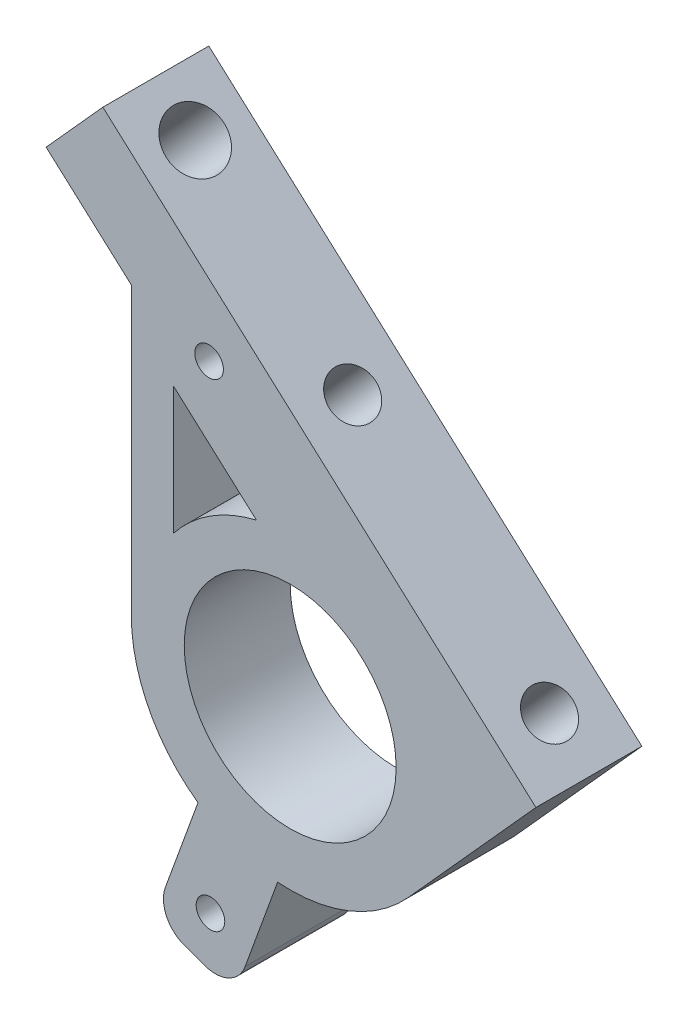
ISO-10303-21;
HEADER;
FILE_DESCRIPTION(('STEP AP214'),'2;1');
FILE_NAME('part.step','',(''),(''),'','','');
FILE_SCHEMA(('AUTOMOTIVE_DESIGN { 1 0 10303 214 1 1 1 1 }'));
ENDSEC;
DATA;
#1=APPLICATION_CONTEXT('core data for automotive mechanical design processes');
#2=APPLICATION_PROTOCOL_DEFINITION('international standard','automotive_design',2000,#1);
#3=PRODUCT_CONTEXT('',#1,'mechanical');
#4=PRODUCT('Part','Part','',(#3));
#5=PRODUCT_RELATED_PRODUCT_CATEGORY('part','',(#4));
#6=PRODUCT_DEFINITION_FORMATION('','',#4);
#7=PRODUCT_DEFINITION_CONTEXT('part definition',#1,'design');
#8=PRODUCT_DEFINITION('design','',#6,#7);
#9=PRODUCT_DEFINITION_SHAPE('','',#8);
#10=(LENGTH_UNIT() NAMED_UNIT(*) SI_UNIT(.MILLI.,.METRE.));
#11=(NAMED_UNIT(*) PLANE_ANGLE_UNIT() SI_UNIT($,.RADIAN.));
#12=(NAMED_UNIT(*) SI_UNIT($,.STERADIAN.) SOLID_ANGLE_UNIT());
#13=UNCERTAINTY_MEASURE_WITH_UNIT(LENGTH_MEASURE(1.E-05),#10,'distance_accuracy_value','');
#14=(GEOMETRIC_REPRESENTATION_CONTEXT(3) GLOBAL_UNCERTAINTY_ASSIGNED_CONTEXT((#13)) GLOBAL_UNIT_ASSIGNED_CONTEXT((#10,
#11,#12)) REPRESENTATION_CONTEXT('',''));
#15=CARTESIAN_POINT('',(0.,0.,0.));
#16=DIRECTION('',(0.,0.,1.));
#17=DIRECTION('',(1.,0.,0.));
#18=AXIS2_PLACEMENT_3D('',#15,#16,#17);
#19=CARTESIAN_POINT('',(0.,0.,10.));
#20=DIRECTION('',(0.,0.,-1.));
#21=DIRECTION('',(-1.,0.,0.));
#22=AXIS2_PLACEMENT_3D('',#19,#20,#21);
#23=CYLINDRICAL_SURFACE('',#22,15.);
#24=DIRECTION('',(0.,0.,-1.));
#25=VECTOR('',#24,1.);
#26=CARTESIAN_POINT('',(-8.70329833664658,-12.2168980540612,28.2048131289452));
#27=LINE('',#26,#25);
#28=CARTESIAN_POINT('',(-8.70329833664658,-12.2168980540612,10.));
#29=VERTEX_POINT('',#28);
#30=CARTESIAN_POINT('',(-8.70329833664658,-12.2168980540612,0.));
#31=VERTEX_POINT('',#30);
#32=EDGE_CURVE('E199',#29,#31,#27,.T.);
#33=ORIENTED_EDGE('',*,*,#32,.F.);
#34=CARTESIAN_POINT('',(0.,0.,10.));
#35=DIRECTION('',(0.,0.,1.));
#36=DIRECTION('',(1.,0.,0.));
#37=AXIS2_PLACEMENT_3D('',#34,#35,#36);
#38=CIRCLE('',#37,15.);
#39=CARTESIAN_POINT('',(-15.,0.,10.));
#40=VERTEX_POINT('',#39);
#41=EDGE_CURVE('E227',#40,#29,#38,.T.);
#42=ORIENTED_EDGE('',*,*,#41,.F.);
#43=DIRECTION('',(0.,0.,-1.));
#44=VECTOR('',#43,1.);
#45=CARTESIAN_POINT('',(-15.,0.,10.));
#46=LINE('',#45,#44);
#47=CARTESIAN_POINT('',(-15.,0.,0.));
#48=VERTEX_POINT('',#47);
#49=EDGE_CURVE('E241',#40,#48,#46,.T.);
#50=ORIENTED_EDGE('',*,*,#49,.T.);
#51=CARTESIAN_POINT('',(0.,0.,0.));
#52=DIRECTION('',(0.,0.,1.));
#53=DIRECTION('',(1.,0.,0.));
#54=AXIS2_PLACEMENT_3D('',#51,#52,#53);
#55=CIRCLE('',#54,15.);
#56=EDGE_CURVE('E242',#48,#31,#55,.T.);
#57=ORIENTED_EDGE('',*,*,#56,.T.);
#58=EDGE_LOOP('',(#33,#42,#50,#57));
#59=FACE_BOUND('',#58,.T.);
#60=ADVANCED_FACE('F39',(#59),#23,.T.);
#61=DIRECTION('',(0.,0.,-1.));
#62=VECTOR('',#61,1.);
#63=CARTESIAN_POINT('',(-1.1857573703593,-14.9530592006665,28.2048131289452));
#64=LINE('',#63,#62);
#65=CARTESIAN_POINT('',(-1.1857573703593,-14.9530592006665,10.));
#66=VERTEX_POINT('',#65);
#67=CARTESIAN_POINT('',(-1.1857573703593,-14.9530592006665,0.));
#68=VERTEX_POINT('',#67);
#69=EDGE_CURVE('E202',#66,#68,#64,.T.);
#70=ORIENTED_EDGE('',*,*,#69,.T.);
#71=CARTESIAN_POINT('',(11.1471723821609,-10.0369590953829,0.));
#72=VERTEX_POINT('',#71);
#73=EDGE_CURVE('E224',#68,#72,#55,.T.);
#74=ORIENTED_EDGE('',*,*,#73,.T.);
#75=DIRECTION('',(0.,0.,-1.));
#76=VECTOR('',#75,1.);
#77=CARTESIAN_POINT('',(11.1471723821609,-10.0369590953829,10.));
#78=LINE('',#77,#76);
#79=CARTESIAN_POINT('',(11.1471723821609,-10.0369590953829,10.));
#80=VERTEX_POINT('',#79);
#81=EDGE_CURVE('E269',#80,#72,#78,.T.);
#82=ORIENTED_EDGE('',*,*,#81,.F.);
#83=EDGE_CURVE('E231',#66,#80,#38,.T.);
#84=ORIENTED_EDGE('',*,*,#83,.F.);
#85=EDGE_LOOP('',(#70,#74,#82,#84));
#86=FACE_BOUND('',#85,.T.);
#87=ADVANCED_FACE('F344',(#86),#23,.T.);
#88=CARTESIAN_POINT('',(0.,0.,10.));
#89=DIRECTION('',(0.,0.,1.));
#90=DIRECTION('',(1.,0.,0.));
#91=AXIS2_PLACEMENT_3D('',#88,#89,#90);
#92=PLANE('',#91);
#93=CARTESIAN_POINT('',(-7.6543469682057,24.3852304515143,10.));
#94=DIRECTION('',(0.,0.,1.));
#95=DIRECTION('',(1.,0.,0.));
#96=AXIS2_PLACEMENT_3D('',#93,#94,#95);
#97=CIRCLE('',#96,1.35);
#98=CARTESIAN_POINT('',(-6.3043469682057,24.3852304515143,10.));
#99=VERTEX_POINT('',#98);
#100=EDGE_CURVE('E442',#99,#99,#97,.T.);
#101=ORIENTED_EDGE('',*,*,#100,.F.);
#102=EDGE_LOOP('',(#101));
#103=FACE_BOUND('',#102,.T.);
#104=DIRECTION('',(-0.743144825477393,0.66913060635886,0.));
#105=VECTOR('',#104,1.);
#106=CARTESIAN_POINT('',(-11.,20.6695063241273,10.));
#107=LINE('',#106,#105);
#108=CARTESIAN_POINT('',(-3.18503915994004,13.632883977708,10.));
#109=VERTEX_POINT('',#108);
#110=CARTESIAN_POINT('',(-11.,20.6695063241273,10.));
#111=VERTEX_POINT('',#110);
#112=EDGE_CURVE('E54',#109,#111,#107,.T.);
#113=ORIENTED_EDGE('',*,*,#112,.F.);
#114=CARTESIAN_POINT('',(0.,0.,10.));
#115=DIRECTION('',(0.,0.,-1.));
#116=DIRECTION('',(-1.,0.,0.));
#117=AXIS2_PLACEMENT_3D('',#114,#115,#116);
#118=CIRCLE('',#117,14.);
#119=CARTESIAN_POINT('',(-11.,8.66025403784439,10.));
#120=VERTEX_POINT('',#119);
#121=EDGE_CURVE('E160',#120,#109,#118,.T.);
#122=ORIENTED_EDGE('',*,*,#121,.F.);
#123=DIRECTION('',(0.,-1.,0.));
#124=VECTOR('',#123,1.);
#125=CARTESIAN_POINT('',(-11.,20.6695063241273,10.));
#126=LINE('',#125,#124);
#127=EDGE_CURVE('E163',#111,#120,#126,.T.);
#128=ORIENTED_EDGE('',*,*,#127,.F.);
#129=EDGE_LOOP('',(#113,#122,#128));
#130=FACE_BOUND('',#129,.T.);
#131=CARTESIAN_POINT('',(-7.52444315316466,-20.67323765729,10.));
#132=DIRECTION('',(0.,0.,1.));
#133=DIRECTION('',(1.,0.,0.));
#134=AXIS2_PLACEMENT_3D('',#131,#132,#133);
#135=CIRCLE('',#134,1.35);
#136=CARTESIAN_POINT('',(-6.17444315316466,-20.67323765729,10.));
#137=VERTEX_POINT('',#136);
#138=EDGE_CURVE('E193',#137,#137,#135,.T.);
#139=ORIENTED_EDGE('',*,*,#138,.F.);
#140=EDGE_LOOP('',(#139));
#141=FACE_BOUND('',#140,.T.);
#142=DIRECTION('',(0.939692620785909,-0.342020143325666,0.));
#143=VECTOR('',#142,1.);
#144=CARTESIAN_POINT('',(-12.8075400565546,-23.4932095034921,10.));
#145=LINE('',#144,#143);
#146=CARTESIAN_POINT('',(-9.98846219419685,-24.5192699334691,10.));
#147=VERTEX_POINT('',#146);
#148=CARTESIAN_POINT('',(-8.10907695262503,-25.2033102201205,10.));
#149=VERTEX_POINT('',#148);
#150=EDGE_CURVE('E212',#147,#149,#145,.T.);
#151=ORIENTED_EDGE('',*,*,#150,.T.);
#152=CARTESIAN_POINT('',(-7.08301652264803,-22.3842323577627,10.));
#153=DIRECTION('',(0.,0.,1.));
#154=DIRECTION('',(1.,0.,0.));
#155=AXIS2_PLACEMENT_3D('',#152,#153,#154);
#156=CIRCLE('',#155,3.);
#157=CARTESIAN_POINT('',(-4.2639386602903,-23.4102927877397,10.));
#158=VERTEX_POINT('',#157);
#159=EDGE_CURVE('E47',#149,#158,#156,.T.);
#160=ORIENTED_EDGE('',*,*,#159,.T.);
#161=DIRECTION('',(0.342020143325667,0.939692620785909,0.));
#162=VECTOR('',#161,1.);
#163=CARTESIAN_POINT('',(-1.1857573703593,-14.9530592006665,10.));
#164=LINE('',#163,#162);
#165=EDGE_CURVE('E209',#158,#66,#164,.T.);
#166=ORIENTED_EDGE('',*,*,#165,.T.);
#167=ORIENTED_EDGE('',*,*,#83,.T.);
#168=DIRECTION('',(0.66913060635886,0.743144825477393,0.));
#169=VECTOR('',#168,1.);
#170=CARTESIAN_POINT('',(17.8384784457495,-2.60551084060896,10.));
#171=LINE('',#170,#169);
#172=CARTESIAN_POINT('',(23.1915232966204,3.33964776321019,10.));
#173=VERTEX_POINT('',#172);
#174=EDGE_CURVE('E230',#80,#173,#171,.T.);
#175=ORIENTED_EDGE('',*,*,#174,.T.);
#176=DIRECTION('',(-0.743144825477393,0.669130606358859,0.));
#177=VECTOR('',#176,1.);
#178=CARTESIAN_POINT('',(-17.6814421046363,40.1418311129475,10.));
#179=LINE('',#178,#177);
#180=CARTESIAN_POINT('',(-17.6814421046363,40.1418311129475,10.));
#181=VERTEX_POINT('',#180);
#182=EDGE_CURVE('E233',#173,#181,#179,.T.);
#183=ORIENTED_EDGE('',*,*,#182,.T.);
#184=DIRECTION('',(-0.669130606358859,-0.743144825477393,0.));
#185=VECTOR('',#184,1.);
#186=CARTESIAN_POINT('',(-23.0344869555071,34.1966725091283,10.));
#187=LINE('',#186,#185);
#188=CARTESIAN_POINT('',(-23.0344869555071,34.1966725091283,10.));
#189=VERTEX_POINT('',#188);
#190=EDGE_CURVE('E235',#181,#189,#187,.T.);
#191=ORIENTED_EDGE('',*,*,#190,.T.);
#192=DIRECTION('',(0.743144825477394,-0.669130606358859,0.));
#193=VECTOR('',#192,1.);
#194=CARTESIAN_POINT('',(-15.,26.9623879605314,10.));
#195=LINE('',#194,#193);
#196=CARTESIAN_POINT('',(-15.,26.9623879605314,10.));
#197=VERTEX_POINT('',#196);
#198=EDGE_CURVE('E237',#189,#197,#195,.T.);
#199=ORIENTED_EDGE('',*,*,#198,.T.);
#200=DIRECTION('',(0.,-1.,0.));
#201=VECTOR('',#200,1.);
#202=CARTESIAN_POINT('',(-15.,0.,10.));
#203=LINE('',#202,#201);
#204=EDGE_CURVE('E239',#197,#40,#203,.T.);
#205=ORIENTED_EDGE('',*,*,#204,.T.);
#206=ORIENTED_EDGE('',*,*,#41,.T.);
#207=DIRECTION('',(-0.342020143325666,-0.939692620785909,0.));
#208=VECTOR('',#207,1.);
#209=CARTESIAN_POINT('',(-8.70329833664658,-12.2168980540612,10.));
#210=LINE('',#209,#208);
#211=CARTESIAN_POINT('',(-11.7814796265776,-20.6741316411344,10.));
#212=VERTEX_POINT('',#211);
#213=EDGE_CURVE('E215',#29,#212,#210,.T.);
#214=ORIENTED_EDGE('',*,*,#213,.T.);
#215=CARTESIAN_POINT('',(-8.96240176421985,-21.7001920711114,10.));
#216=DIRECTION('',(0.,0.,1.));
#217=DIRECTION('',(1.,0.,0.));
#218=AXIS2_PLACEMENT_3D('',#215,#216,#217);
#219=CIRCLE('',#218,3.);
#220=EDGE_CURVE('E284',#212,#147,#219,.T.);
#221=ORIENTED_EDGE('',*,*,#220,.T.);
#222=EDGE_LOOP('',(#151,#160,#166,#167,#175,#183,#191,#199,#205,#206,#214,#221));
#223=FACE_BOUND('',#222,.T.);
#224=CARTESIAN_POINT('',(0.,0.,10.));
#225=DIRECTION('',(0.,0.,1.));
#226=DIRECTION('',(1.,0.,0.));
#227=AXIS2_PLACEMENT_3D('',#224,#225,#226);
#228=CIRCLE('',#227,10.);
#229=CARTESIAN_POINT('',(10.,0.,10.));
#230=VERTEX_POINT('',#229);
#231=EDGE_CURVE('E221',#230,#230,#228,.T.);
#232=ORIENTED_EDGE('',*,*,#231,.F.);
#233=EDGE_LOOP('',(#232));
#234=FACE_BOUND('',#233,.T.);
#235=ADVANCED_FACE('F288',(#103,#130,#141,#223,#234),#92,.T.);
#236=CARTESIAN_POINT('',(0.,0.,0.));
#237=DIRECTION('',(0.,0.,1.));
#238=DIRECTION('',(1.,0.,0.));
#239=AXIS2_PLACEMENT_3D('',#236,#237,#238);
#240=PLANE('',#239);
#241=CARTESIAN_POINT('',(-7.6543469682057,24.3852304515143,0.));
#242=DIRECTION('',(0.,0.,1.));
#243=DIRECTION('',(1.,0.,0.));
#244=AXIS2_PLACEMENT_3D('',#241,#242,#243);
#245=CIRCLE('',#244,1.35);
#246=CARTESIAN_POINT('',(-6.3043469682057,24.3852304515143,0.));
#247=VERTEX_POINT('',#246);
#248=EDGE_CURVE('E166',#247,#247,#245,.F.);
#249=ORIENTED_EDGE('',*,*,#248,.F.);
#250=EDGE_LOOP('',(#249));
#251=FACE_BOUND('',#250,.T.);
#252=CARTESIAN_POINT('',(0.,0.,0.));
#253=DIRECTION('',(0.,0.,-1.));
#254=DIRECTION('',(-1.,0.,0.));
#255=AXIS2_PLACEMENT_3D('',#252,#253,#254);
#256=CIRCLE('',#255,14.);
#257=CARTESIAN_POINT('',(-11.,8.66025403784439,0.));
#258=VERTEX_POINT('',#257);
#259=CARTESIAN_POINT('',(-3.18503915994004,13.632883977708,0.));
#260=VERTEX_POINT('',#259);
#261=EDGE_CURVE('E62',#258,#260,#256,.T.);
#262=ORIENTED_EDGE('',*,*,#261,.T.);
#263=DIRECTION('',(-0.743144825477393,0.66913060635886,0.));
#264=VECTOR('',#263,1.);
#265=CARTESIAN_POINT('',(-11.,20.6695063241273,0.));
#266=LINE('',#265,#264);
#267=CARTESIAN_POINT('',(-11.,20.6695063241273,0.));
#268=VERTEX_POINT('',#267);
#269=EDGE_CURVE('E147',#260,#268,#266,.T.);
#270=ORIENTED_EDGE('',*,*,#269,.T.);
#271=DIRECTION('',(0.,-1.,0.));
#272=VECTOR('',#271,1.);
#273=CARTESIAN_POINT('',(-11.,20.6695063241273,0.));
#274=LINE('',#273,#272);
#275=EDGE_CURVE('E154',#268,#258,#274,.T.);
#276=ORIENTED_EDGE('',*,*,#275,.T.);
#277=EDGE_LOOP('',(#262,#270,#276));
#278=FACE_BOUND('',#277,.T.);
#279=CARTESIAN_POINT('',(-7.52444315316466,-20.67323765729,0.));
#280=DIRECTION('',(0.,0.,1.));
#281=DIRECTION('',(1.,0.,0.));
#282=AXIS2_PLACEMENT_3D('',#279,#280,#281);
#283=CIRCLE('',#282,1.35);
#284=CARTESIAN_POINT('',(-6.17444315316466,-20.67323765729,0.));
#285=VERTEX_POINT('',#284);
#286=EDGE_CURVE('E196',#285,#285,#283,.F.);
#287=ORIENTED_EDGE('',*,*,#286,.F.);
#288=EDGE_LOOP('',(#287));
#289=FACE_BOUND('',#288,.T.);
#290=DIRECTION('',(0.342020143325666,0.939692620785909,0.));
#291=VECTOR('',#290,1.);
#292=CARTESIAN_POINT('',(-1.1857573703593,-14.9530592006665,0.));
#293=LINE('',#292,#291);
#294=CARTESIAN_POINT('',(-4.2639386602903,-23.4102927877397,0.));
#295=VERTEX_POINT('',#294);
#296=EDGE_CURVE('E200',#295,#68,#293,.T.);
#297=ORIENTED_EDGE('',*,*,#296,.F.);
#298=CARTESIAN_POINT('',(-7.08301652264803,-22.3842323577627,0.));
#299=DIRECTION('',(0.,0.,1.));
#300=DIRECTION('',(1.,0.,0.));
#301=AXIS2_PLACEMENT_3D('',#298,#299,#300);
#302=CIRCLE('',#301,3.);
#303=CARTESIAN_POINT('',(-8.10907695262503,-25.2033102201205,0.));
#304=VERTEX_POINT('',#303);
#305=EDGE_CURVE('E277',#295,#304,#302,.F.);
#306=ORIENTED_EDGE('',*,*,#305,.T.);
#307=DIRECTION('',(0.939692620785909,-0.342020143325666,0.));
#308=VECTOR('',#307,1.);
#309=CARTESIAN_POINT('',(-12.8075400565546,-23.4932095034921,0.));
#310=LINE('',#309,#308);
#311=CARTESIAN_POINT('',(-9.98846219419685,-24.5192699334691,0.));
#312=VERTEX_POINT('',#311);
#313=EDGE_CURVE('E203',#312,#304,#310,.T.);
#314=ORIENTED_EDGE('',*,*,#313,.F.);
#315=CARTESIAN_POINT('',(-8.96240176421985,-21.7001920711114,0.));
#316=DIRECTION('',(0.,0.,1.));
#317=DIRECTION('',(1.,0.,0.));
#318=AXIS2_PLACEMENT_3D('',#315,#316,#317);
#319=CIRCLE('',#318,3.);
#320=CARTESIAN_POINT('',(-11.7814796265776,-20.6741316411344,0.));
#321=VERTEX_POINT('',#320);
#322=EDGE_CURVE('E275',#312,#321,#319,.F.);
#323=ORIENTED_EDGE('',*,*,#322,.T.);
#324=DIRECTION('',(-0.342020143325666,-0.939692620785909,0.));
#325=VECTOR('',#324,1.);
#326=CARTESIAN_POINT('',(-8.70329833664658,-12.2168980540612,0.));
#327=LINE('',#326,#325);
#328=EDGE_CURVE('E206',#31,#321,#327,.T.);
#329=ORIENTED_EDGE('',*,*,#328,.F.);
#330=ORIENTED_EDGE('',*,*,#56,.F.);
#331=DIRECTION('',(0.,-1.,0.));
#332=VECTOR('',#331,1.);
#333=CARTESIAN_POINT('',(-15.,0.,0.));
#334=LINE('',#333,#332);
#335=CARTESIAN_POINT('',(-15.,26.9623879605314,0.));
#336=VERTEX_POINT('',#335);
#337=EDGE_CURVE('E253',#336,#48,#334,.T.);
#338=ORIENTED_EDGE('',*,*,#337,.F.);
#339=DIRECTION('',(0.743144825477394,-0.669130606358859,0.));
#340=VECTOR('',#339,1.);
#341=CARTESIAN_POINT('',(-15.,26.9623879605314,0.));
#342=LINE('',#341,#340);
#343=CARTESIAN_POINT('',(-23.0344869555071,34.1966725091283,0.));
#344=VERTEX_POINT('',#343);
#345=EDGE_CURVE('E251',#344,#336,#342,.T.);
#346=ORIENTED_EDGE('',*,*,#345,.F.);
#347=DIRECTION('',(-0.669130606358859,-0.743144825477393,0.));
#348=VECTOR('',#347,1.);
#349=CARTESIAN_POINT('',(-23.0344869555071,34.1966725091283,0.));
#350=LINE('',#349,#348);
#351=CARTESIAN_POINT('',(-17.6814421046363,40.1418311129475,0.));
#352=VERTEX_POINT('',#351);
#353=EDGE_CURVE('E249',#352,#344,#350,.T.);
#354=ORIENTED_EDGE('',*,*,#353,.F.);
#355=DIRECTION('',(-0.743144825477393,0.669130606358859,0.));
#356=VECTOR('',#355,1.);
#357=CARTESIAN_POINT('',(-17.6814421046363,40.1418311129475,0.));
#358=LINE('',#357,#356);
#359=CARTESIAN_POINT('',(23.1915232966204,3.33964776321019,0.));
#360=VERTEX_POINT('',#359);
#361=EDGE_CURVE('E247',#360,#352,#358,.T.);
#362=ORIENTED_EDGE('',*,*,#361,.F.);
#363=DIRECTION('',(0.669130606358858,0.743144825477394,0.));
#364=VECTOR('',#363,1.);
#365=CARTESIAN_POINT('',(23.1915232966204,3.33964776321019,0.));
#366=LINE('',#365,#364);
#367=EDGE_CURVE('E245',#72,#360,#366,.T.);
#368=ORIENTED_EDGE('',*,*,#367,.F.);
#369=ORIENTED_EDGE('',*,*,#73,.F.);
#370=EDGE_LOOP('',(#297,#306,#314,#323,#329,#330,#338,#346,#354,#362,#368,#369));
#371=FACE_BOUND('',#370,.T.);
#372=CARTESIAN_POINT('',(0.,0.,0.));
#373=DIRECTION('',(0.,0.,1.));
#374=DIRECTION('',(1.,0.,0.));
#375=AXIS2_PLACEMENT_3D('',#372,#373,#374);
#376=CIRCLE('',#375,10.);
#377=CARTESIAN_POINT('',(10.,0.,0.));
#378=VERTEX_POINT('',#377);
#379=EDGE_CURVE('E211',#378,#378,#376,.T.);
#380=ORIENTED_EDGE('',*,*,#379,.T.);
#381=EDGE_LOOP('',(#380));
#382=FACE_BOUND('',#381,.T.);
#383=ADVANCED_FACE('F158',(#251,#278,#289,#371,#382),#240,.F.);
#384=CARTESIAN_POINT('',(23.1915232966204,3.33964776321019,10.));
#385=DIRECTION('',(-0.743144825477394,0.669130606358858,0.));
#386=DIRECTION('',(-0.669130606358858,-0.743144825477394,0.));
#387=AXIS2_PLACEMENT_3D('',#384,#385,#386);
#388=PLANE('',#387);
#389=ORIENTED_EDGE('',*,*,#367,.T.);
#390=DIRECTION('',(0.,0.,-1.));
#391=VECTOR('',#390,1.);
#392=CARTESIAN_POINT('',(23.1915232966204,3.33964776321019,10.));
#393=LINE('',#392,#391);
#394=EDGE_CURVE('E266',#173,#360,#393,.T.);
#395=ORIENTED_EDGE('',*,*,#394,.F.);
#396=ORIENTED_EDGE('',*,*,#174,.F.);
#397=ORIENTED_EDGE('',*,*,#81,.T.);
#398=EDGE_LOOP('',(#389,#395,#396,#397));
#399=FACE_BOUND('',#398,.T.);
#400=ADVANCED_FACE('F342',(#399),#388,.F.);
#401=CARTESIAN_POINT('',(-17.6814421046363,40.1418311129475,10.));
#402=DIRECTION('',(-0.669130606358859,-0.743144825477393,0.));
#403=DIRECTION('',(0.743144825477393,-0.669130606358859,0.));
#404=AXIS2_PLACEMENT_3D('',#401,#402,#403);
#405=PLANE('',#404);
#406=CARTESIAN_POINT('',(0.897178532298572,23.413565953976,5.00000000000001));
#407=DIRECTION('',(0.669130606358859,0.743144825477393,0.));
#408=DIRECTION('',(-0.743144825477393,0.669130606358859,0.));
#409=AXIS2_PLACEMENT_3D('',#406,#407,#408);
#410=CIRCLE('',#409,2.2);
#411=CARTESIAN_POINT('',(-0.737740083751693,24.8856532879655,5.00000000000001));
#412=VERTEX_POINT('',#411);
#413=EDGE_CURVE('E180',#412,#412,#410,.T.);
#414=ORIENTED_EDGE('',*,*,#413,.F.);
#415=EDGE_LOOP('',(#414));
#416=FACE_BOUND('',#415,.T.);
#417=CARTESIAN_POINT('',(19.4757991692334,6.68530079500449,5.00000000000001));
#418=DIRECTION('',(0.669130606358859,0.743144825477393,0.));
#419=DIRECTION('',(-0.743144825477393,0.669130606358859,0.));
#420=AXIS2_PLACEMENT_3D('',#417,#418,#419);
#421=CIRCLE('',#420,2.2);
#422=CARTESIAN_POINT('',(17.8408805531831,8.15738812899398,5.00000000000001));
#423=VERTEX_POINT('',#422);
#424=EDGE_CURVE('E174',#423,#423,#421,.T.);
#425=ORIENTED_EDGE('',*,*,#424,.F.);
#426=EDGE_LOOP('',(#425));
#427=FACE_BOUND('',#426,.T.);
#428=CARTESIAN_POINT('',(-13.9657179772493,36.7961780811532,5.00000000000001));
#429=DIRECTION('',(0.669130606358859,0.743144825477393,0.));
#430=DIRECTION('',(-0.743144825477393,0.669130606358859,0.));
#431=AXIS2_PLACEMENT_3D('',#428,#429,#430);
#432=CIRCLE('',#431,2.75);
#433=CARTESIAN_POINT('',(-16.0093662473121,38.63628724864,5.00000000000001));
#434=VERTEX_POINT('',#433);
#435=EDGE_CURVE('E179',#434,#434,#432,.T.);
#436=ORIENTED_EDGE('',*,*,#435,.F.);
#437=EDGE_LOOP('',(#436));
#438=FACE_BOUND('',#437,.T.);
#439=ORIENTED_EDGE('',*,*,#361,.T.);
#440=DIRECTION('',(0.,0.,-1.));
#441=VECTOR('',#440,1.);
#442=CARTESIAN_POINT('',(-17.6814421046363,40.1418311129475,10.));
#443=LINE('',#442,#441);
#444=EDGE_CURVE('E263',#181,#352,#443,.T.);
#445=ORIENTED_EDGE('',*,*,#444,.F.);
#446=ORIENTED_EDGE('',*,*,#182,.F.);
#447=ORIENTED_EDGE('',*,*,#394,.T.);
#448=EDGE_LOOP('',(#439,#445,#446,#447));
#449=FACE_BOUND('',#448,.T.);
#450=ADVANCED_FACE('F336',(#416,#427,#438,#449),#405,.F.);
#451=CARTESIAN_POINT('',(-23.0344869555071,34.1966725091283,10.));
#452=DIRECTION('',(0.743144825477393,-0.669130606358859,0.));
#453=DIRECTION('',(0.669130606358859,0.743144825477393,0.));
#454=AXIS2_PLACEMENT_3D('',#451,#452,#453);
#455=PLANE('',#454);
#456=ORIENTED_EDGE('',*,*,#353,.T.);
#457=DIRECTION('',(0.,0.,-1.));
#458=VECTOR('',#457,1.);
#459=CARTESIAN_POINT('',(-23.0344869555071,34.1966725091283,10.));
#460=LINE('',#459,#458);
#461=EDGE_CURVE('E260',#189,#344,#460,.T.);
#462=ORIENTED_EDGE('',*,*,#461,.F.);
#463=ORIENTED_EDGE('',*,*,#190,.F.);
#464=ORIENTED_EDGE('',*,*,#444,.T.);
#465=EDGE_LOOP('',(#456,#462,#463,#464));
#466=FACE_BOUND('',#465,.T.);
#467=ADVANCED_FACE('F332',(#466),#455,.F.);
#468=CARTESIAN_POINT('',(-15.,26.9623879605314,10.));
#469=DIRECTION('',(0.669130606358859,0.743144825477394,0.));
#470=DIRECTION('',(-0.743144825477394,0.669130606358859,0.));
#471=AXIS2_PLACEMENT_3D('',#468,#469,#470);
#472=PLANE('',#471);
#473=CARTESIAN_POINT('',(-19.3187628281202,30.851019477334,5.00000000000001));
#474=DIRECTION('',(0.669130606358859,0.743144825477394,0.));
#475=DIRECTION('',(-0.743144825477394,0.669130606358859,0.));
#476=AXIS2_PLACEMENT_3D('',#473,#474,#475);
#477=CIRCLE('',#476,2.75);
#478=CARTESIAN_POINT('',(-21.362411098183,32.6911286448209,5.00000000000001));
#479=VERTEX_POINT('',#478);
#480=EDGE_CURVE('E190',#479,#479,#477,.F.);
#481=ORIENTED_EDGE('',*,*,#480,.F.);
#482=EDGE_LOOP('',(#481));
#483=FACE_BOUND('',#482,.T.);
#484=ORIENTED_EDGE('',*,*,#345,.T.);
#485=DIRECTION('',(0.,0.,-1.));
#486=VECTOR('',#485,1.);
#487=CARTESIAN_POINT('',(-15.,26.9623879605314,10.));
#488=LINE('',#487,#486);
#489=EDGE_CURVE('E257',#197,#336,#488,.T.);
#490=ORIENTED_EDGE('',*,*,#489,.F.);
#491=ORIENTED_EDGE('',*,*,#198,.F.);
#492=ORIENTED_EDGE('',*,*,#461,.T.);
#493=EDGE_LOOP('',(#484,#490,#491,#492));
#494=FACE_BOUND('',#493,.T.);
#495=ADVANCED_FACE('F328',(#483,#494),#472,.F.);
#496=CARTESIAN_POINT('',(-15.,0.,10.));
#497=DIRECTION('',(1.,0.,0.));
#498=DIRECTION('',(0.,0.,-1.));
#499=AXIS2_PLACEMENT_3D('',#496,#497,#498);
#500=PLANE('',#499);
#501=ORIENTED_EDGE('',*,*,#337,.T.);
#502=ORIENTED_EDGE('',*,*,#49,.F.);
#503=ORIENTED_EDGE('',*,*,#204,.F.);
#504=ORIENTED_EDGE('',*,*,#489,.T.);
#505=EDGE_LOOP('',(#501,#502,#503,#504));
#506=FACE_BOUND('',#505,.T.);
#507=ADVANCED_FACE('F322',(#506),#500,.F.);
#508=CARTESIAN_POINT('',(0.,0.,10.));
#509=DIRECTION('',(0.,0.,-1.));
#510=DIRECTION('',(-1.,0.,0.));
#511=AXIS2_PLACEMENT_3D('',#508,#509,#510);
#512=CYLINDRICAL_SURFACE('',#511,10.);
#513=ORIENTED_EDGE('',*,*,#231,.T.);
#514=EDGE_LOOP('',(#513));
#515=FACE_BOUND('',#514,.T.);
#516=ORIENTED_EDGE('',*,*,#379,.F.);
#517=EDGE_LOOP('',(#516));
#518=FACE_BOUND('',#517,.T.);
#519=ADVANCED_FACE('F376',(#515,#518),#512,.F.);
#520=CARTESIAN_POINT('',(-8.70329833664658,-12.2168980540612,28.2048131289452));
#521=DIRECTION('',(0.939692620785909,-0.342020143325666,0.));
#522=DIRECTION('',(0.342020143325666,0.939692620785909,0.));
#523=AXIS2_PLACEMENT_3D('',#520,#521,#522);
#524=PLANE('',#523);
#525=ORIENTED_EDGE('',*,*,#328,.T.);
#526=DIRECTION('',(0.,0.,-1.));
#527=VECTOR('',#526,1.);
#528=CARTESIAN_POINT('',(-11.7814796265776,-20.6741316411344,28.2048131289452));
#529=LINE('',#528,#527);
#530=EDGE_CURVE('E11',#321,#212,#529,.F.);
#531=ORIENTED_EDGE('',*,*,#530,.T.);
#532=ORIENTED_EDGE('',*,*,#213,.F.);
#533=ORIENTED_EDGE('',*,*,#32,.T.);
#534=EDGE_LOOP('',(#525,#531,#532,#533));
#535=FACE_BOUND('',#534,.T.);
#536=ADVANCED_FACE('F313',(#535),#524,.F.);
#537=CARTESIAN_POINT('',(-12.8075400565546,-23.4932095034921,28.2048131289452));
#538=DIRECTION('',(0.342020143325666,0.939692620785909,0.));
#539=DIRECTION('',(-0.939692620785909,0.342020143325666,0.));
#540=AXIS2_PLACEMENT_3D('',#537,#538,#539);
#541=PLANE('',#540);
#542=ORIENTED_EDGE('',*,*,#313,.T.);
#543=DIRECTION('',(0.,0.,-1.));
#544=VECTOR('',#543,1.);
#545=CARTESIAN_POINT('',(-8.10907695262503,-25.2033102201205,28.2048131289452));
#546=LINE('',#545,#544);
#547=EDGE_CURVE('E282',#304,#149,#546,.F.);
#548=ORIENTED_EDGE('',*,*,#547,.T.);
#549=ORIENTED_EDGE('',*,*,#150,.F.);
#550=DIRECTION('',(0.,0.,-1.));
#551=VECTOR('',#550,1.);
#552=CARTESIAN_POINT('',(-9.98846219419685,-24.5192699334691,28.2048131289452));
#553=LINE('',#552,#551);
#554=EDGE_CURVE('E279',#147,#312,#553,.T.);
#555=ORIENTED_EDGE('',*,*,#554,.T.);
#556=EDGE_LOOP('',(#542,#548,#549,#555));
#557=FACE_BOUND('',#556,.T.);
#558=ADVANCED_FACE('F305',(#557),#541,.F.);
#559=CARTESIAN_POINT('',(-1.1857573703593,-14.9530592006665,28.2048131289452));
#560=DIRECTION('',(-0.939692620785909,0.342020143325667,0.));
#561=DIRECTION('',(-0.342020143325667,-0.939692620785909,0.));
#562=AXIS2_PLACEMENT_3D('',#559,#560,#561);
#563=PLANE('',#562);
#564=ORIENTED_EDGE('',*,*,#165,.F.);
#565=DIRECTION('',(0.,0.,-1.));
#566=VECTOR('',#565,1.);
#567=CARTESIAN_POINT('',(-4.2639386602903,-23.4102927877397,28.2048131289452));
#568=LINE('',#567,#566);
#569=EDGE_CURVE('E272',#158,#295,#568,.T.);
#570=ORIENTED_EDGE('',*,*,#569,.T.);
#571=ORIENTED_EDGE('',*,*,#296,.T.);
#572=ORIENTED_EDGE('',*,*,#69,.F.);
#573=EDGE_LOOP('',(#564,#570,#571,#572));
#574=FACE_BOUND('',#573,.T.);
#575=ADVANCED_FACE('F296',(#574),#563,.F.);
#576=CARTESIAN_POINT('',(-7.52444315316466,-20.67323765729,-3.81837661840736));
#577=DIRECTION('',(0.,0.,1.));
#578=DIRECTION('',(1.,0.,0.));
#579=AXIS2_PLACEMENT_3D('',#576,#577,#578);
#580=CYLINDRICAL_SURFACE('',#579,1.35);
#581=ORIENTED_EDGE('',*,*,#286,.T.);
#582=EDGE_LOOP('',(#581));
#583=FACE_BOUND('',#582,.T.);
#584=ORIENTED_EDGE('',*,*,#138,.T.);
#585=EDGE_LOOP('',(#584));
#586=FACE_BOUND('',#585,.T.);
#587=ADVANCED_FACE('F357',(#583,#586),#580,.F.);
#588=CARTESIAN_POINT('',(-7.08301652264803,-22.3842323577627,28.2048131289452));
#589=DIRECTION('',(0.,0.,-1.));
#590=DIRECTION('',(-1.,0.,0.));
#591=AXIS2_PLACEMENT_3D('',#588,#589,#590);
#592=CYLINDRICAL_SURFACE('',#591,3.);
#593=ORIENTED_EDGE('',*,*,#159,.F.);
#594=ORIENTED_EDGE('',*,*,#547,.F.);
#595=ORIENTED_EDGE('',*,*,#305,.F.);
#596=ORIENTED_EDGE('',*,*,#569,.F.);
#597=EDGE_LOOP('',(#593,#594,#595,#596));
#598=FACE_BOUND('',#597,.T.);
#599=ADVANCED_FACE('F299',(#598),#592,.T.);
#600=CARTESIAN_POINT('',(-8.96240176421985,-21.7001920711114,28.2048131289452));
#601=DIRECTION('',(0.,0.,-1.));
#602=DIRECTION('',(-1.,0.,0.));
#603=AXIS2_PLACEMENT_3D('',#600,#601,#602);
#604=CYLINDRICAL_SURFACE('',#603,3.);
#605=ORIENTED_EDGE('',*,*,#220,.F.);
#606=ORIENTED_EDGE('',*,*,#530,.F.);
#607=ORIENTED_EDGE('',*,*,#322,.F.);
#608=ORIENTED_EDGE('',*,*,#554,.F.);
#609=EDGE_LOOP('',(#605,#606,#607,#608));
#610=FACE_BOUND('',#609,.T.);
#611=ADVANCED_FACE('F41',(#610),#604,.T.);
#612=CARTESIAN_POINT('',(-24.5233775099342,25.0707092768477,5.00000000000001));
#613=DIRECTION('',(0.669130606358859,0.743144825477393,0.));
#614=DIRECTION('',(-0.743144825477393,0.669130606358859,0.));
#615=AXIS2_PLACEMENT_3D('',#612,#613,#614);
#616=CYLINDRICAL_SURFACE('',#615,2.75);
#617=ORIENTED_EDGE('',*,*,#480,.T.);
#618=EDGE_LOOP('',(#617));
#619=FACE_BOUND('',#618,.T.);
#620=ORIENTED_EDGE('',*,*,#435,.T.);
#621=EDGE_LOOP('',(#620));
#622=FACE_BOUND('',#621,.T.);
#623=ADVANCED_FACE('F362',(#619,#622),#616,.F.);
#624=CARTESIAN_POINT('',(14.1227543183625,0.740142191185345,5.00000000000001));
#625=DIRECTION('',(0.669130606358859,0.743144825477393,0.));
#626=DIRECTION('',(-0.743144825477393,0.669130606358859,0.));
#627=AXIS2_PLACEMENT_3D('',#624,#625,#626);
#628=CYLINDRICAL_SURFACE('',#627,2.2);
#629=CARTESIAN_POINT('',(14.1227543183625,0.740142191185345,5.00000000000001));
#630=DIRECTION('',(0.669130606358859,0.743144825477393,0.));
#631=DIRECTION('',(-0.743144825477393,0.669130606358859,0.));
#632=AXIS2_PLACEMENT_3D('',#629,#630,#631);
#633=CIRCLE('',#632,2.2);
#634=CARTESIAN_POINT('',(12.4878357023123,2.21222952517483,5.00000000000001));
#635=VERTEX_POINT('',#634);
#636=EDGE_CURVE('E183',#635,#635,#633,.T.);
#637=ORIENTED_EDGE('',*,*,#636,.F.);
#638=EDGE_LOOP('',(#637));
#639=FACE_BOUND('',#638,.T.);
#640=ORIENTED_EDGE('',*,*,#424,.T.);
#641=EDGE_LOOP('',(#640));
#642=FACE_BOUND('',#641,.T.);
#643=ADVANCED_FACE('F402',(#639,#642),#628,.F.);
#644=CARTESIAN_POINT('',(14.1227543183625,0.740142191185345,5.00000000000001));
#645=DIRECTION('',(0.669130606358859,0.743144825477393,0.));
#646=DIRECTION('',(-0.743144825477393,0.669130606358859,0.));
#647=AXIS2_PLACEMENT_3D('',#644,#645,#646);
#648=PLANE('',#647);
#649=ORIENTED_EDGE('',*,*,#636,.T.);
#650=EDGE_LOOP('',(#649));
#651=FACE_BOUND('',#650,.T.);
#652=ADVANCED_FACE('F406',(#651),#648,.T.);
#653=CARTESIAN_POINT('',(-4.4558663185723,17.4684073501568,5.00000000000001));
#654=DIRECTION('',(0.669130606358859,0.743144825477393,0.));
#655=DIRECTION('',(-0.743144825477393,0.669130606358859,0.));
#656=AXIS2_PLACEMENT_3D('',#653,#654,#655);
#657=CYLINDRICAL_SURFACE('',#656,2.2);
#658=CARTESIAN_POINT('',(-4.4558663185723,17.4684073501568,5.00000000000001));
#659=DIRECTION('',(0.669130606358859,0.743144825477393,0.));
#660=DIRECTION('',(-0.743144825477393,0.669130606358859,0.));
#661=AXIS2_PLACEMENT_3D('',#658,#659,#660);
#662=CIRCLE('',#661,2.2);
#663=CARTESIAN_POINT('',(-6.09078493462257,18.9404946841463,5.00000000000001));
#664=VERTEX_POINT('',#663);
#665=EDGE_CURVE('E176',#664,#664,#662,.T.);
#666=ORIENTED_EDGE('',*,*,#665,.F.);
#667=EDGE_LOOP('',(#666));
#668=FACE_BOUND('',#667,.T.);
#669=ORIENTED_EDGE('',*,*,#413,.T.);
#670=EDGE_LOOP('',(#669));
#671=FACE_BOUND('',#670,.T.);
#672=ADVANCED_FACE('F412',(#668,#671),#657,.F.);
#673=CARTESIAN_POINT('',(-4.4558663185723,17.4684073501568,5.00000000000001));
#674=DIRECTION('',(0.669130606358859,0.743144825477393,0.));
#675=DIRECTION('',(-0.743144825477393,0.669130606358859,0.));
#676=AXIS2_PLACEMENT_3D('',#673,#674,#675);
#677=PLANE('',#676);
#678=ORIENTED_EDGE('',*,*,#665,.T.);
#679=EDGE_LOOP('',(#678));
#680=FACE_BOUND('',#679,.T.);
#681=ADVANCED_FACE('F420',(#680),#677,.T.);
#682=CARTESIAN_POINT('',(-11.,20.6695063241273,0.));
#683=DIRECTION('',(0.66913060635886,0.743144825477393,0.));
#684=DIRECTION('',(-0.743144825477393,0.66913060635886,0.));
#685=AXIS2_PLACEMENT_3D('',#682,#683,#684);
#686=PLANE('',#685);
#687=ORIENTED_EDGE('',*,*,#112,.T.);
#688=DIRECTION('',(0.,0.,1.));
#689=VECTOR('',#688,1.);
#690=CARTESIAN_POINT('',(-11.,20.6695063241273,0.));
#691=LINE('',#690,#689);
#692=EDGE_CURVE('E143',#268,#111,#691,.T.);
#693=ORIENTED_EDGE('',*,*,#692,.F.);
#694=ORIENTED_EDGE('',*,*,#269,.F.);
#695=DIRECTION('',(0.,0.,1.));
#696=VECTOR('',#695,1.);
#697=CARTESIAN_POINT('',(-3.18503915994004,13.632883977708,0.));
#698=LINE('',#697,#696);
#699=EDGE_CURVE('E172',#260,#109,#698,.T.);
#700=ORIENTED_EDGE('',*,*,#699,.T.);
#701=EDGE_LOOP('',(#687,#693,#694,#700));
#702=FACE_BOUND('',#701,.T.);
#703=ADVANCED_FACE('F145',(#702),#686,.F.);
#704=CARTESIAN_POINT('',(0.,0.,0.));
#705=DIRECTION('',(0.,0.,1.));
#706=DIRECTION('',(1.,0.,0.));
#707=AXIS2_PLACEMENT_3D('',#704,#705,#706);
#708=CYLINDRICAL_SURFACE('',#707,14.);
#709=ORIENTED_EDGE('',*,*,#121,.T.);
#710=ORIENTED_EDGE('',*,*,#699,.F.);
#711=ORIENTED_EDGE('',*,*,#261,.F.);
#712=DIRECTION('',(0.,0.,1.));
#713=VECTOR('',#712,1.);
#714=CARTESIAN_POINT('',(-11.,8.66025403784439,0.));
#715=LINE('',#714,#713);
#716=EDGE_CURVE('E151',#258,#120,#715,.T.);
#717=ORIENTED_EDGE('',*,*,#716,.T.);
#718=EDGE_LOOP('',(#709,#710,#711,#717));
#719=FACE_BOUND('',#718,.T.);
#720=ADVANCED_FACE('F427',(#719),#708,.T.);
#721=CARTESIAN_POINT('',(-11.,20.6695063241273,0.));
#722=DIRECTION('',(-1.,0.,0.));
#723=DIRECTION('',(0.,0.,1.));
#724=AXIS2_PLACEMENT_3D('',#721,#722,#723);
#725=PLANE('',#724);
#726=ORIENTED_EDGE('',*,*,#127,.T.);
#727=ORIENTED_EDGE('',*,*,#716,.F.);
#728=ORIENTED_EDGE('',*,*,#275,.F.);
#729=ORIENTED_EDGE('',*,*,#692,.T.);
#730=EDGE_LOOP('',(#726,#727,#728,#729));
#731=FACE_BOUND('',#730,.T.);
#732=ADVANCED_FACE('F155',(#731),#725,.F.);
#733=CARTESIAN_POINT('',(-7.6543469682057,24.3852304515143,-3.81837661840736));
#734=DIRECTION('',(0.,0.,1.));
#735=DIRECTION('',(1.,0.,0.));
#736=AXIS2_PLACEMENT_3D('',#733,#734,#735);
#737=CYLINDRICAL_SURFACE('',#736,1.35);
#738=ORIENTED_EDGE('',*,*,#248,.T.);
#739=EDGE_LOOP('',(#738));
#740=FACE_BOUND('',#739,.T.);
#741=ORIENTED_EDGE('',*,*,#100,.T.);
#742=EDGE_LOOP('',(#741));
#743=FACE_BOUND('',#742,.T.);
#744=ADVANCED_FACE('F430',(#740,#743),#737,.F.);
#745=CLOSED_SHELL('',(#60,#87,#235,#383,#400,#450,#467,#495,#507,#519,#536,#558,#575,#587,#599,
#611,#623,#643,#652,#672,#681,#703,#720,#732,#744));
#746=MANIFOLD_SOLID_BREP('B2',#745);
#747=ADVANCED_BREP_SHAPE_REPRESENTATION('',(#18,#746),#14);
#748=SHAPE_DEFINITION_REPRESENTATION(#9,#747);
ENDSEC;
END-ISO-10303-21;
